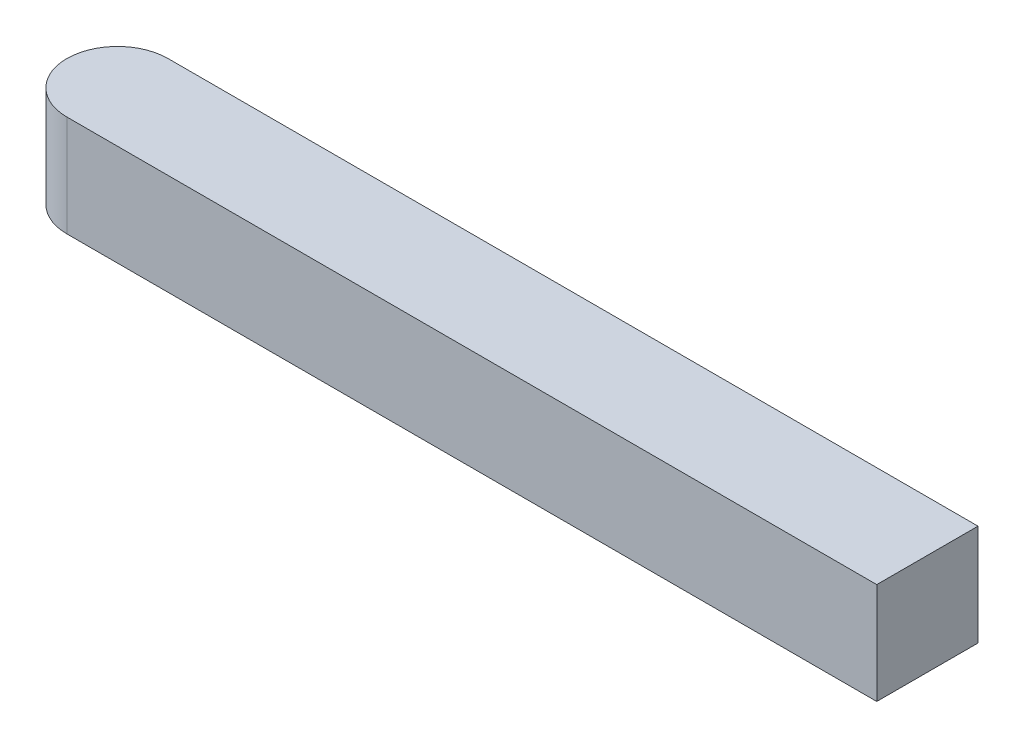
ISO-10303-21;
HEADER;
FILE_DESCRIPTION(('STEP AP214'),'2;1');
FILE_NAME('part.step','',(''),(''),'','','');
FILE_SCHEMA(('AUTOMOTIVE_DESIGN { 1 0 10303 214 1 1 1 1 }'));
ENDSEC;
DATA;
#1=APPLICATION_CONTEXT('core data for automotive mechanical design processes');
#2=APPLICATION_PROTOCOL_DEFINITION('international standard','automotive_design',2000,#1);
#3=PRODUCT_CONTEXT('',#1,'mechanical');
#4=PRODUCT('Part','Part','',(#3));
#5=PRODUCT_RELATED_PRODUCT_CATEGORY('part','',(#4));
#6=PRODUCT_DEFINITION_FORMATION('','',#4);
#7=PRODUCT_DEFINITION_CONTEXT('part definition',#1,'design');
#8=PRODUCT_DEFINITION('design','',#6,#7);
#9=PRODUCT_DEFINITION_SHAPE('','',#8);
#10=(LENGTH_UNIT() NAMED_UNIT(*) SI_UNIT(.MILLI.,.METRE.));
#11=(NAMED_UNIT(*) PLANE_ANGLE_UNIT() SI_UNIT($,.RADIAN.));
#12=(NAMED_UNIT(*) SI_UNIT($,.STERADIAN.) SOLID_ANGLE_UNIT());
#13=UNCERTAINTY_MEASURE_WITH_UNIT(LENGTH_MEASURE(1.E-05),#10,'distance_accuracy_value','');
#14=(GEOMETRIC_REPRESENTATION_CONTEXT(3) GLOBAL_UNCERTAINTY_ASSIGNED_CONTEXT((#13)) GLOBAL_UNIT_ASSIGNED_CONTEXT((#10,
#11,#12)) REPRESENTATION_CONTEXT('',''));
#15=CARTESIAN_POINT('',(0.,0.,0.));
#16=DIRECTION('',(0.,0.,1.));
#17=DIRECTION('',(1.,0.,0.));
#18=AXIS2_PLACEMENT_3D('',#15,#16,#17);
#19=CARTESIAN_POINT('',(0.,4.,-2.00000000000003));
#20=DIRECTION('',(-1.,0.,0.));
#21=DIRECTION('',(0.,0.,1.));
#22=AXIS2_PLACEMENT_3D('',#19,#20,#21);
#23=PLANE('',#22);
#24=DIRECTION('',(0.,0.,-1.));
#25=VECTOR('',#24,1.);
#26=CARTESIAN_POINT('',(0.,0.,-2.00000000000002));
#27=LINE('',#26,#25);
#28=CARTESIAN_POINT('',(0.,0.,2.));
#29=VERTEX_POINT('',#28);
#30=CARTESIAN_POINT('',(0.,0.,-2.00000000000002));
#31=VERTEX_POINT('',#30);
#32=EDGE_CURVE('E122',#29,#31,#27,.T.);
#33=ORIENTED_EDGE('',*,*,#32,.T.);
#34=DIRECTION('',(0.,-1.,0.));
#35=VECTOR('',#34,1.);
#36=CARTESIAN_POINT('',(0.,4.,-2.00000000000003));
#37=LINE('',#36,#35);
#38=CARTESIAN_POINT('',(0.,4.,-2.00000000000003));
#39=VERTEX_POINT('',#38);
#40=EDGE_CURVE('E13',#39,#31,#37,.T.);
#41=ORIENTED_EDGE('',*,*,#40,.F.);
#42=DIRECTION('',(0.,0.,-1.));
#43=VECTOR('',#42,1.);
#44=CARTESIAN_POINT('',(0.,4.,-2.00000000000003));
#45=LINE('',#44,#43);
#46=CARTESIAN_POINT('',(0.,4.,2.));
#47=VERTEX_POINT('',#46);
#48=EDGE_CURVE('E105',#47,#39,#45,.T.);
#49=ORIENTED_EDGE('',*,*,#48,.F.);
#50=DIRECTION('',(0.,-1.,0.));
#51=VECTOR('',#50,1.);
#52=CARTESIAN_POINT('',(0.,4.,2.));
#53=LINE('',#52,#51);
#54=EDGE_CURVE('E118',#47,#29,#53,.T.);
#55=ORIENTED_EDGE('',*,*,#54,.T.);
#56=EDGE_LOOP('',(#33,#41,#49,#55));
#57=FACE_BOUND('',#56,.T.);
#58=ADVANCED_FACE('F53',(#57),#23,.F.);
#59=CARTESIAN_POINT('',(0.,4.,-2.00000000000003));
#60=DIRECTION('',(0.,0.,1.));
#61=DIRECTION('',(1.,0.,0.));
#62=AXIS2_PLACEMENT_3D('',#59,#60,#61);
#63=PLANE('',#62);
#64=DIRECTION('',(-1.,0.,0.));
#65=VECTOR('',#64,1.);
#66=CARTESIAN_POINT('',(0.,0.,-2.00000000000002));
#67=LINE('',#66,#65);
#68=CARTESIAN_POINT('',(-32.,0.,-2.00000000000002));
#69=VERTEX_POINT('',#68);
#70=EDGE_CURVE('E110',#31,#69,#67,.T.);
#71=ORIENTED_EDGE('',*,*,#70,.T.);
#72=DIRECTION('',(0.,-1.,0.));
#73=VECTOR('',#72,1.);
#74=CARTESIAN_POINT('',(-32.,4.,-2.00000000000002));
#75=LINE('',#74,#73);
#76=CARTESIAN_POINT('',(-32.,4.,-2.00000000000002));
#77=VERTEX_POINT('',#76);
#78=EDGE_CURVE('E62',#77,#69,#75,.T.);
#79=ORIENTED_EDGE('',*,*,#78,.F.);
#80=DIRECTION('',(-1.,0.,0.));
#81=VECTOR('',#80,1.);
#82=CARTESIAN_POINT('',(0.,4.,-2.00000000000003));
#83=LINE('',#82,#81);
#84=EDGE_CURVE('E100',#39,#77,#83,.T.);
#85=ORIENTED_EDGE('',*,*,#84,.F.);
#86=ORIENTED_EDGE('',*,*,#40,.T.);
#87=EDGE_LOOP('',(#71,#79,#85,#86));
#88=FACE_BOUND('',#87,.T.);
#89=ADVANCED_FACE('F109',(#88),#63,.F.);
#90=CARTESIAN_POINT('',(-32.,4.00000000000001,0.));
#91=DIRECTION('',(0.,-1.,0.));
#92=DIRECTION('',(0.,0.,-1.));
#93=AXIS2_PLACEMENT_3D('',#90,#91,#92);
#94=CYLINDRICAL_SURFACE('',#93,2.);
#95=CARTESIAN_POINT('',(-32.,0.,0.));
#96=DIRECTION('',(0.,1.,0.));
#97=DIRECTION('',(0.,0.,1.));
#98=AXIS2_PLACEMENT_3D('',#95,#96,#97);
#99=CIRCLE('',#98,2.);
#100=CARTESIAN_POINT('',(-32.,0.,1.99999999999999));
#101=VERTEX_POINT('',#100);
#102=EDGE_CURVE('E87',#69,#101,#99,.T.);
#103=ORIENTED_EDGE('',*,*,#102,.T.);
#104=DIRECTION('',(0.,-1.,0.));
#105=VECTOR('',#104,1.);
#106=CARTESIAN_POINT('',(-32.,3.99999999999998,1.99999999999999));
#107=LINE('',#106,#105);
#108=CARTESIAN_POINT('',(-32.,3.99999999999998,1.99999999999999));
#109=VERTEX_POINT('',#108);
#110=EDGE_CURVE('E112',#109,#101,#107,.T.);
#111=ORIENTED_EDGE('',*,*,#110,.F.);
#112=CARTESIAN_POINT('',(-32.,4.00000000000001,0.));
#113=DIRECTION('',(0.,1.,0.));
#114=DIRECTION('',(0.,0.,1.));
#115=AXIS2_PLACEMENT_3D('',#112,#113,#114);
#116=CIRCLE('',#115,2.);
#117=EDGE_CURVE('E103',#77,#109,#116,.T.);
#118=ORIENTED_EDGE('',*,*,#117,.F.);
#119=ORIENTED_EDGE('',*,*,#78,.T.);
#120=EDGE_LOOP('',(#103,#111,#118,#119));
#121=FACE_BOUND('',#120,.T.);
#122=ADVANCED_FACE('F113',(#121),#94,.T.);
#123=CARTESIAN_POINT('',(0.,4.,2.));
#124=DIRECTION('',(0.,0.,-1.));
#125=DIRECTION('',(-1.,0.,0.));
#126=AXIS2_PLACEMENT_3D('',#123,#124,#125);
#127=PLANE('',#126);
#128=DIRECTION('',(1.,0.,0.));
#129=VECTOR('',#128,1.);
#130=CARTESIAN_POINT('',(0.,0.,2.));
#131=LINE('',#130,#129);
#132=EDGE_CURVE('E93',#101,#29,#131,.T.);
#133=ORIENTED_EDGE('',*,*,#132,.T.);
#134=ORIENTED_EDGE('',*,*,#54,.F.);
#135=DIRECTION('',(1.,0.,0.));
#136=VECTOR('',#135,1.);
#137=CARTESIAN_POINT('',(0.,4.,2.));
#138=LINE('',#137,#136);
#139=EDGE_CURVE('E70',#109,#47,#138,.T.);
#140=ORIENTED_EDGE('',*,*,#139,.F.);
#141=ORIENTED_EDGE('',*,*,#110,.T.);
#142=EDGE_LOOP('',(#133,#134,#140,#141));
#143=FACE_BOUND('',#142,.T.);
#144=ADVANCED_FACE('F136',(#143),#127,.F.);
#145=CARTESIAN_POINT('',(-32.,4.00000000000001,0.));
#146=DIRECTION('',(0.,1.,0.));
#147=DIRECTION('',(0.,0.,1.));
#148=AXIS2_PLACEMENT_3D('',#145,#146,#147);
#149=PLANE('',#148);
#150=ORIENTED_EDGE('',*,*,#48,.T.);
#151=ORIENTED_EDGE('',*,*,#84,.T.);
#152=ORIENTED_EDGE('',*,*,#117,.T.);
#153=ORIENTED_EDGE('',*,*,#139,.T.);
#154=EDGE_LOOP('',(#150,#151,#152,#153));
#155=FACE_BOUND('',#154,.T.);
#156=ADVANCED_FACE('F101',(#155),#149,.T.);
#157=CARTESIAN_POINT('',(-32.,0.,0.));
#158=DIRECTION('',(0.,1.,0.));
#159=DIRECTION('',(0.,0.,1.));
#160=AXIS2_PLACEMENT_3D('',#157,#158,#159);
#161=PLANE('',#160);
#162=ORIENTED_EDGE('',*,*,#32,.F.);
#163=ORIENTED_EDGE('',*,*,#132,.F.);
#164=ORIENTED_EDGE('',*,*,#102,.F.);
#165=ORIENTED_EDGE('',*,*,#70,.F.);
#166=EDGE_LOOP('',(#162,#163,#164,#165));
#167=FACE_BOUND('',#166,.T.);
#168=ADVANCED_FACE('F139',(#167),#161,.F.);
#169=CLOSED_SHELL('',(#58,#89,#122,#144,#156,#168));
#170=MANIFOLD_SOLID_BREP('B2',#169);
#171=ADVANCED_BREP_SHAPE_REPRESENTATION('',(#18,#170),#14);
#172=SHAPE_DEFINITION_REPRESENTATION(#9,#171);
ENDSEC;
END-ISO-10303-21;
